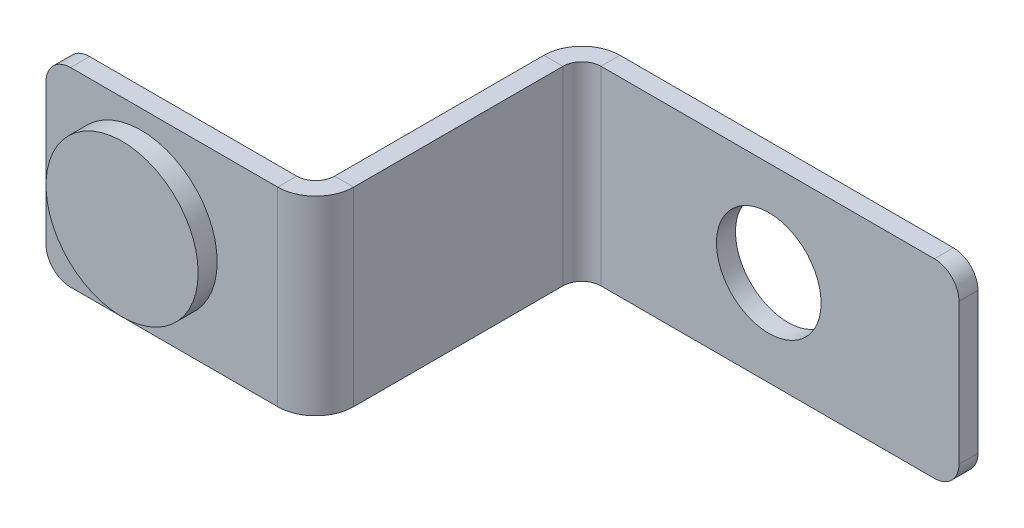
ISO-10303-21;
HEADER;
FILE_DESCRIPTION(('STEP AP214'),'2;1');
FILE_NAME('part.step','',(''),(''),'','','');
FILE_SCHEMA(('AUTOMOTIVE_DESIGN { 1 0 10303 214 1 1 1 1 }'));
ENDSEC;
DATA;
#1=APPLICATION_CONTEXT('core data for automotive mechanical design processes');
#2=APPLICATION_PROTOCOL_DEFINITION('international standard','automotive_design',2000,#1);
#3=PRODUCT_CONTEXT('',#1,'mechanical');
#4=PRODUCT('Part','Part','',(#3));
#5=PRODUCT_RELATED_PRODUCT_CATEGORY('part','',(#4));
#6=PRODUCT_DEFINITION_FORMATION('','',#4);
#7=PRODUCT_DEFINITION_CONTEXT('part definition',#1,'design');
#8=PRODUCT_DEFINITION('design','',#6,#7);
#9=PRODUCT_DEFINITION_SHAPE('','',#8);
#10=(LENGTH_UNIT() NAMED_UNIT(*) SI_UNIT(.MILLI.,.METRE.));
#11=(NAMED_UNIT(*) PLANE_ANGLE_UNIT() SI_UNIT($,.RADIAN.));
#12=(NAMED_UNIT(*) SI_UNIT($,.STERADIAN.) SOLID_ANGLE_UNIT());
#13=UNCERTAINTY_MEASURE_WITH_UNIT(LENGTH_MEASURE(1.E-05),#10,'distance_accuracy_value','');
#14=(GEOMETRIC_REPRESENTATION_CONTEXT(3) GLOBAL_UNCERTAINTY_ASSIGNED_CONTEXT((#13)) GLOBAL_UNIT_ASSIGNED_CONTEXT((#10,
#11,#12)) REPRESENTATION_CONTEXT('',''));
#15=CARTESIAN_POINT('',(0.,0.,0.));
#16=DIRECTION('',(0.,0.,1.));
#17=DIRECTION('',(1.,0.,0.));
#18=AXIS2_PLACEMENT_3D('',#15,#16,#17);
#19=CARTESIAN_POINT('',(5.,5.,15.));
#20=DIRECTION('',(0.,0.,-1.));
#21=DIRECTION('',(-1.,0.,0.));
#22=AXIS2_PLACEMENT_3D('',#19,#20,#21);
#23=CYLINDRICAL_SURFACE('',#22,4.);
#24=CARTESIAN_POINT('',(5.,5.,15.));
#25=DIRECTION('',(0.,0.,1.));
#26=DIRECTION('',(1.,0.,0.));
#27=AXIS2_PLACEMENT_3D('',#24,#25,#26);
#28=CIRCLE('',#27,4.);
#29=CARTESIAN_POINT('',(9.00000000000001,5.,15.));
#30=VERTEX_POINT('',#29);
#31=EDGE_CURVE('E12',#30,#30,#28,.T.);
#32=ORIENTED_EDGE('',*,*,#31,.F.);
#33=EDGE_LOOP('',(#32));
#34=FACE_BOUND('',#33,.T.);
#35=CARTESIAN_POINT('',(5.,5.,14.));
#36=DIRECTION('',(0.,0.,1.));
#37=DIRECTION('',(1.,0.,0.));
#38=AXIS2_PLACEMENT_3D('',#35,#36,#37);
#39=CIRCLE('',#38,4.);
#40=CARTESIAN_POINT('',(9.00000000000001,5.,14.));
#41=VERTEX_POINT('',#40);
#42=EDGE_CURVE('E56',#41,#41,#39,.T.);
#43=ORIENTED_EDGE('',*,*,#42,.T.);
#44=EDGE_LOOP('',(#43));
#45=FACE_BOUND('',#44,.T.);
#46=ADVANCED_FACE('F53',(#34,#45),#23,.T.);
#47=CARTESIAN_POINT('',(5.,5.,15.));
#48=DIRECTION('',(0.,0.,1.));
#49=DIRECTION('',(1.,0.,0.));
#50=AXIS2_PLACEMENT_3D('',#47,#48,#49);
#51=PLANE('',#50);
#52=ORIENTED_EDGE('',*,*,#31,.T.);
#53=EDGE_LOOP('',(#52));
#54=FACE_BOUND('',#53,.T.);
#55=ADVANCED_FACE('F68',(#54),#51,.T.);
#56=CARTESIAN_POINT('',(5.,5.,14.));
#57=DIRECTION('',(0.,0.,1.));
#58=DIRECTION('',(1.,0.,0.));
#59=AXIS2_PLACEMENT_3D('',#56,#57,#58);
#60=PLANE('',#59);
#61=ORIENTED_EDGE('',*,*,#42,.F.);
#62=EDGE_LOOP('',(#61));
#63=FACE_BOUND('',#62,.T.);
#64=ADVANCED_FACE('F66',(#63),#60,.F.);
#65=CLOSED_SHELL('',(#46,#55,#64));
#66=MANIFOLD_SOLID_BREP('B2',#65);
#67=CARTESIAN_POINT('',(13.1780972450961,1.29277566539924,-18.8853215796969));
#68=DIRECTION('',(1.,0.,0.));
#69=DIRECTION('',(0.,0.,-1.));
#70=AXIS2_PLACEMENT_3D('',#67,#68,#69);
#71=PLANE('',#70);
#72=DIRECTION('',(0.,0.,-1.));
#73=VECTOR('',#72,1.);
#74=CARTESIAN_POINT('',(13.1780972450962,0.,12.5291270895046));
#75=LINE('',#74,#73);
#76=CARTESIAN_POINT('',(13.1780972450962,0.,12.));
#77=VERTEX_POINT('',#76);
#78=CARTESIAN_POINT('',(13.1780972450962,0.,1.00000000000001));
#79=VERTEX_POINT('',#78);
#80=EDGE_CURVE('E98',#77,#79,#75,.T.);
#81=ORIENTED_EDGE('',*,*,#80,.F.);
#82=DIRECTION('',(0.,1.,0.));
#83=VECTOR('',#82,1.);
#84=CARTESIAN_POINT('',(13.1780972450962,1.29277566539924,12.));
#85=LINE('',#84,#83);
#86=CARTESIAN_POINT('',(13.1780972450962,10.,12.));
#87=VERTEX_POINT('',#86);
#88=EDGE_CURVE('E326',#77,#87,#85,.T.);
#89=ORIENTED_EDGE('',*,*,#88,.T.);
#90=DIRECTION('',(0.,0.,1.));
#91=VECTOR('',#90,1.);
#92=CARTESIAN_POINT('',(13.1780972450962,10.,12.5291270895046));
#93=LINE('',#92,#91);
#94=CARTESIAN_POINT('',(13.1780972450962,10.,1.00000000000001));
#95=VERTEX_POINT('',#94);
#96=EDGE_CURVE('E334',#95,#87,#93,.T.);
#97=ORIENTED_EDGE('',*,*,#96,.F.);
#98=DIRECTION('',(0.,1.,0.));
#99=VECTOR('',#98,1.);
#100=CARTESIAN_POINT('',(13.1780972450962,1.29277566539924,1.00000000000001));
#101=LINE('',#100,#99);
#102=EDGE_CURVE('E317',#79,#95,#101,.T.);
#103=ORIENTED_EDGE('',*,*,#102,.F.);
#104=EDGE_LOOP('',(#81,#89,#97,#103));
#105=FACE_BOUND('',#104,.T.);
#106=ADVANCED_FACE('F94',(#105),#71,.F.);
#107=CARTESIAN_POINT('',(13.1780972450962,0.,12.5291270895046));
#108=DIRECTION('',(0.,-1.,0.));
#109=DIRECTION('',(-1.,0.,0.));
#110=AXIS2_PLACEMENT_3D('',#107,#108,#109);
#111=PLANE('',#110);
#112=DIRECTION('',(1.,0.,0.));
#113=VECTOR('',#112,1.);
#114=CARTESIAN_POINT('',(13.1780972450962,0.,12.));
#115=LINE('',#114,#113);
#116=CARTESIAN_POINT('',(14.1780972450962,0.,12.));
#117=VERTEX_POINT('',#116);
#118=EDGE_CURVE('E329',#77,#117,#115,.T.);
#119=ORIENTED_EDGE('',*,*,#118,.F.);
#120=ORIENTED_EDGE('',*,*,#80,.T.);
#121=DIRECTION('',(1.,0.,0.));
#122=VECTOR('',#121,1.);
#123=CARTESIAN_POINT('',(13.1780972450962,0.,1.00000000000001));
#124=LINE('',#123,#122);
#125=CARTESIAN_POINT('',(14.1780972450962,0.,1.));
#126=VERTEX_POINT('',#125);
#127=EDGE_CURVE('E324',#79,#126,#124,.T.);
#128=ORIENTED_EDGE('',*,*,#127,.T.);
#129=DIRECTION('',(0.,0.,-1.));
#130=VECTOR('',#129,1.);
#131=CARTESIAN_POINT('',(14.1780972450962,0.,12.5291270895046));
#132=LINE('',#131,#130);
#133=EDGE_CURVE('E119',#117,#126,#132,.T.);
#134=ORIENTED_EDGE('',*,*,#133,.F.);
#135=EDGE_LOOP('',(#119,#120,#128,#134));
#136=FACE_BOUND('',#135,.T.);
#137=ADVANCED_FACE('F340',(#136),#111,.T.);
#138=CARTESIAN_POINT('',(13.1780972450962,10.,12.5291270895046));
#139=DIRECTION('',(0.,1.,0.));
#140=DIRECTION('',(1.,0.,0.));
#141=AXIS2_PLACEMENT_3D('',#138,#139,#140);
#142=PLANE('',#141);
#143=DIRECTION('',(-1.,0.,0.));
#144=VECTOR('',#143,1.);
#145=CARTESIAN_POINT('',(13.1780972450962,10.,12.));
#146=LINE('',#145,#144);
#147=CARTESIAN_POINT('',(14.1780972450962,10.,12.));
#148=VERTEX_POINT('',#147);
#149=EDGE_CURVE('E51',#148,#87,#146,.T.);
#150=ORIENTED_EDGE('',*,*,#149,.F.);
#151=DIRECTION('',(0.,0.,1.));
#152=VECTOR('',#151,1.);
#153=CARTESIAN_POINT('',(14.1780972450962,10.,12.5291270895046));
#154=LINE('',#153,#152);
#155=CARTESIAN_POINT('',(14.1780972450962,10.,1.));
#156=VERTEX_POINT('',#155);
#157=EDGE_CURVE('E111',#156,#148,#154,.T.);
#158=ORIENTED_EDGE('',*,*,#157,.F.);
#159=DIRECTION('',(-1.,0.,0.));
#160=VECTOR('',#159,1.);
#161=CARTESIAN_POINT('',(13.1780972450962,10.,1.00000000000001));
#162=LINE('',#161,#160);
#163=EDGE_CURVE('E320',#156,#95,#162,.T.);
#164=ORIENTED_EDGE('',*,*,#163,.T.);
#165=ORIENTED_EDGE('',*,*,#96,.T.);
#166=EDGE_LOOP('',(#150,#158,#164,#165));
#167=FACE_BOUND('',#166,.T.);
#168=ADVANCED_FACE('F96',(#167),#142,.T.);
#169=CARTESIAN_POINT('',(14.1780972450961,1.29277566539924,-18.8853215796969));
#170=DIRECTION('',(1.,0.,0.));
#171=DIRECTION('',(0.,0.,-1.));
#172=AXIS2_PLACEMENT_3D('',#169,#170,#171);
#173=PLANE('',#172);
#174=DIRECTION('',(0.,1.,0.));
#175=VECTOR('',#174,1.);
#176=CARTESIAN_POINT('',(14.1780972450962,1.29277566539924,12.));
#177=LINE('',#176,#175);
#178=EDGE_CURVE('E103',#117,#148,#177,.T.);
#179=ORIENTED_EDGE('',*,*,#178,.F.);
#180=ORIENTED_EDGE('',*,*,#133,.T.);
#181=DIRECTION('',(0.,1.,0.));
#182=VECTOR('',#181,1.);
#183=CARTESIAN_POINT('',(14.1780972450962,1.29277566539924,1.));
#184=LINE('',#183,#182);
#185=EDGE_CURVE('E322',#126,#156,#184,.T.);
#186=ORIENTED_EDGE('',*,*,#185,.T.);
#187=ORIENTED_EDGE('',*,*,#157,.T.);
#188=EDGE_LOOP('',(#179,#180,#186,#187));
#189=FACE_BOUND('',#188,.T.);
#190=ADVANCED_FACE('F336',(#189),#173,.T.);
#191=CARTESIAN_POINT('',(32.7072243346008,1.29277566539924,-1.));
#192=DIRECTION('',(0.,0.,1.));
#193=DIRECTION('',(1.,0.,0.));
#194=AXIS2_PLACEMENT_3D('',#191,#192,#193);
#195=CYLINDRICAL_SURFACE('',#194,1.29277566539924);
#196=CARTESIAN_POINT('',(32.7072243346008,1.29277566539924,0.));
#197=DIRECTION('',(0.,0.,1.));
#198=DIRECTION('',(1.,0.,0.));
#199=AXIS2_PLACEMENT_3D('',#196,#197,#198);
#200=CIRCLE('',#199,1.29277566539924);
#201=CARTESIAN_POINT('',(32.7072243346008,0.,0.));
#202=VERTEX_POINT('',#201);
#203=CARTESIAN_POINT('',(34.,1.29277566539925,0.));
#204=VERTEX_POINT('',#203);
#205=EDGE_CURVE('E278',#202,#204,#200,.T.);
#206=ORIENTED_EDGE('',*,*,#205,.F.);
#207=DIRECTION('',(0.,0.,1.));
#208=VECTOR('',#207,1.);
#209=CARTESIAN_POINT('',(32.7072243346008,0.,-1.));
#210=LINE('',#209,#208);
#211=CARTESIAN_POINT('',(32.7072243346008,0.,-1.));
#212=VERTEX_POINT('',#211);
#213=EDGE_CURVE('E265',#212,#202,#210,.T.);
#214=ORIENTED_EDGE('',*,*,#213,.F.);
#215=CARTESIAN_POINT('',(32.7072243346008,1.29277566539924,-1.));
#216=DIRECTION('',(0.,0.,1.));
#217=DIRECTION('',(1.,0.,0.));
#218=AXIS2_PLACEMENT_3D('',#215,#216,#217);
#219=CIRCLE('',#218,1.29277566539924);
#220=CARTESIAN_POINT('',(34.,1.29277566539925,-1.));
#221=VERTEX_POINT('',#220);
#222=EDGE_CURVE('E306',#212,#221,#219,.T.);
#223=ORIENTED_EDGE('',*,*,#222,.T.);
#224=DIRECTION('',(0.,0.,1.));
#225=VECTOR('',#224,1.);
#226=CARTESIAN_POINT('',(34.,1.29277566539925,-1.));
#227=LINE('',#226,#225);
#228=EDGE_CURVE('E304',#221,#204,#227,.T.);
#229=ORIENTED_EDGE('',*,*,#228,.T.);
#230=EDGE_LOOP('',(#206,#214,#223,#229));
#231=FACE_BOUND('',#230,.T.);
#232=ADVANCED_FACE('F380',(#231),#195,.T.);
#233=CARTESIAN_POINT('',(34.,1.29277566539925,-1.));
#234=DIRECTION('',(1.,0.,0.));
#235=DIRECTION('',(0.,0.,-1.));
#236=AXIS2_PLACEMENT_3D('',#233,#234,#235);
#237=PLANE('',#236);
#238=DIRECTION('',(0.,1.,0.));
#239=VECTOR('',#238,1.);
#240=CARTESIAN_POINT('',(34.,1.29277566539925,0.));
#241=LINE('',#240,#239);
#242=CARTESIAN_POINT('',(34.,8.70722433460075,0.));
#243=VERTEX_POINT('',#242);
#244=EDGE_CURVE('E275',#204,#243,#241,.T.);
#245=ORIENTED_EDGE('',*,*,#244,.F.);
#246=ORIENTED_EDGE('',*,*,#228,.F.);
#247=DIRECTION('',(0.,1.,0.));
#248=VECTOR('',#247,1.);
#249=CARTESIAN_POINT('',(34.,1.29277566539925,-1.));
#250=LINE('',#249,#248);
#251=CARTESIAN_POINT('',(34.,8.70722433460075,-1.));
#252=VERTEX_POINT('',#251);
#253=EDGE_CURVE('E301',#221,#252,#250,.T.);
#254=ORIENTED_EDGE('',*,*,#253,.T.);
#255=DIRECTION('',(0.,0.,1.));
#256=VECTOR('',#255,1.);
#257=CARTESIAN_POINT('',(34.,8.70722433460075,-1.));
#258=LINE('',#257,#256);
#259=EDGE_CURVE('E299',#252,#243,#258,.T.);
#260=ORIENTED_EDGE('',*,*,#259,.T.);
#261=EDGE_LOOP('',(#245,#246,#254,#260));
#262=FACE_BOUND('',#261,.T.);
#263=ADVANCED_FACE('F383',(#262),#237,.T.);
#264=CARTESIAN_POINT('',(32.7072243346008,8.70722433460076,-1.));
#265=DIRECTION('',(0.,0.,1.));
#266=DIRECTION('',(1.,0.,0.));
#267=AXIS2_PLACEMENT_3D('',#264,#265,#266);
#268=CYLINDRICAL_SURFACE('',#267,1.29277566539924);
#269=CARTESIAN_POINT('',(32.7072243346008,8.70722433460076,0.));
#270=DIRECTION('',(0.,0.,1.));
#271=DIRECTION('',(-1.,0.,0.));
#272=AXIS2_PLACEMENT_3D('',#269,#270,#271);
#273=CIRCLE('',#272,1.29277566539924);
#274=CARTESIAN_POINT('',(32.7072243346008,10.,0.));
#275=VERTEX_POINT('',#274);
#276=EDGE_CURVE('E272',#243,#275,#273,.T.);
#277=ORIENTED_EDGE('',*,*,#276,.F.);
#278=ORIENTED_EDGE('',*,*,#259,.F.);
#279=CARTESIAN_POINT('',(32.7072243346008,8.70722433460076,-1.));
#280=DIRECTION('',(0.,0.,1.));
#281=DIRECTION('',(-1.,0.,0.));
#282=AXIS2_PLACEMENT_3D('',#279,#280,#281);
#283=CIRCLE('',#282,1.29277566539924);
#284=CARTESIAN_POINT('',(32.7072243346008,10.,-1.));
#285=VERTEX_POINT('',#284);
#286=EDGE_CURVE('E296',#252,#285,#283,.T.);
#287=ORIENTED_EDGE('',*,*,#286,.T.);
#288=DIRECTION('',(0.,0.,1.));
#289=VECTOR('',#288,1.);
#290=CARTESIAN_POINT('',(32.7072243346008,10.,-1.));
#291=LINE('',#290,#289);
#292=EDGE_CURVE('E294',#285,#275,#291,.T.);
#293=ORIENTED_EDGE('',*,*,#292,.T.);
#294=EDGE_LOOP('',(#277,#278,#287,#293));
#295=FACE_BOUND('',#294,.T.);
#296=ADVANCED_FACE('F385',(#295),#268,.T.);
#297=CARTESIAN_POINT('',(24.,5.,-1.));
#298=DIRECTION('',(0.,0.,1.));
#299=DIRECTION('',(1.,0.,0.));
#300=AXIS2_PLACEMENT_3D('',#297,#298,#299);
#301=CYLINDRICAL_SURFACE('',#300,2.75);
#302=CARTESIAN_POINT('',(24.,5.,-1.));
#303=DIRECTION('',(0.,0.,1.));
#304=DIRECTION('',(1.,0.,0.));
#305=AXIS2_PLACEMENT_3D('',#302,#303,#304);
#306=CIRCLE('',#305,2.75);
#307=CARTESIAN_POINT('',(26.75,5.,-1.));
#308=VERTEX_POINT('',#307);
#309=EDGE_CURVE('E288',#308,#308,#306,.T.);
#310=ORIENTED_EDGE('',*,*,#309,.F.);
#311=EDGE_LOOP('',(#310));
#312=FACE_BOUND('',#311,.T.);
#313=CARTESIAN_POINT('',(24.,5.,0.));
#314=DIRECTION('',(0.,0.,1.));
#315=DIRECTION('',(1.,0.,0.));
#316=AXIS2_PLACEMENT_3D('',#313,#314,#315);
#317=CIRCLE('',#316,2.75);
#318=CARTESIAN_POINT('',(26.75,5.,0.));
#319=VERTEX_POINT('',#318);
#320=EDGE_CURVE('E291',#319,#319,#317,.T.);
#321=ORIENTED_EDGE('',*,*,#320,.T.);
#322=EDGE_LOOP('',(#321));
#323=FACE_BOUND('',#322,.T.);
#324=ADVANCED_FACE('F387',(#312,#323),#301,.F.);
#325=CARTESIAN_POINT('',(32.7072243346008,1.29277566539924,-1.));
#326=DIRECTION('',(0.,0.,1.));
#327=DIRECTION('',(1.,0.,0.));
#328=AXIS2_PLACEMENT_3D('',#325,#326,#327);
#329=PLANE('',#328);
#330=ORIENTED_EDGE('',*,*,#309,.T.);
#331=EDGE_LOOP('',(#330));
#332=FACE_BOUND('',#331,.T.);
#333=DIRECTION('',(1.,0.,0.));
#334=VECTOR('',#333,1.);
#335=CARTESIAN_POINT('',(1.29277566539925,0.,-1.));
#336=LINE('',#335,#334);
#337=CARTESIAN_POINT('',(15.1780972450962,0.,-1.));
#338=VERTEX_POINT('',#337);
#339=EDGE_CURVE('E268',#338,#212,#336,.T.);
#340=ORIENTED_EDGE('',*,*,#339,.F.);
#341=DIRECTION('',(0.,1.,0.));
#342=VECTOR('',#341,1.);
#343=CARTESIAN_POINT('',(15.1780972450962,1.29277566539924,-1.));
#344=LINE('',#343,#342);
#345=CARTESIAN_POINT('',(15.1780972450962,10.,-1.));
#346=VERTEX_POINT('',#345);
#347=EDGE_CURVE('E285',#338,#346,#344,.T.);
#348=ORIENTED_EDGE('',*,*,#347,.T.);
#349=DIRECTION('',(-1.,0.,0.));
#350=VECTOR('',#349,1.);
#351=CARTESIAN_POINT('',(1.29277566539925,10.,-1.));
#352=LINE('',#351,#350);
#353=EDGE_CURVE('E283',#285,#346,#352,.T.);
#354=ORIENTED_EDGE('',*,*,#353,.F.);
#355=ORIENTED_EDGE('',*,*,#286,.F.);
#356=ORIENTED_EDGE('',*,*,#253,.F.);
#357=ORIENTED_EDGE('',*,*,#222,.F.);
#358=EDGE_LOOP('',(#340,#348,#354,#355,#356,#357));
#359=FACE_BOUND('',#358,.T.);
#360=ADVANCED_FACE('F375',(#332,#359),#329,.F.);
#361=CARTESIAN_POINT('',(1.29277566539925,10.,-1.));
#362=DIRECTION('',(0.,1.,0.));
#363=DIRECTION('',(0.,0.,1.));
#364=AXIS2_PLACEMENT_3D('',#361,#362,#363);
#365=PLANE('',#364);
#366=DIRECTION('',(0.,0.,-1.));
#367=VECTOR('',#366,1.);
#368=CARTESIAN_POINT('',(15.1780972450962,10.,-1.));
#369=LINE('',#368,#367);
#370=CARTESIAN_POINT('',(15.1780972450962,10.,0.));
#371=VERTEX_POINT('',#370);
#372=EDGE_CURVE('E309',#371,#346,#369,.T.);
#373=ORIENTED_EDGE('',*,*,#372,.F.);
#374=DIRECTION('',(-1.,0.,0.));
#375=VECTOR('',#374,1.);
#376=CARTESIAN_POINT('',(1.29277566539925,10.,0.));
#377=LINE('',#376,#375);
#378=EDGE_CURVE('E270',#275,#371,#377,.T.);
#379=ORIENTED_EDGE('',*,*,#378,.F.);
#380=ORIENTED_EDGE('',*,*,#292,.F.);
#381=ORIENTED_EDGE('',*,*,#353,.T.);
#382=EDGE_LOOP('',(#373,#379,#380,#381));
#383=FACE_BOUND('',#382,.T.);
#384=ADVANCED_FACE('F363',(#383),#365,.T.);
#385=CARTESIAN_POINT('',(32.7072243346008,1.29277566539924,0.));
#386=DIRECTION('',(0.,0.,1.));
#387=DIRECTION('',(1.,0.,0.));
#388=AXIS2_PLACEMENT_3D('',#385,#386,#387);
#389=PLANE('',#388);
#390=DIRECTION('',(0.,1.,0.));
#391=VECTOR('',#390,1.);
#392=CARTESIAN_POINT('',(15.1780972450962,1.29277566539924,0.));
#393=LINE('',#392,#391);
#394=CARTESIAN_POINT('',(15.1780972450962,0.,0.));
#395=VERTEX_POINT('',#394);
#396=EDGE_CURVE('E312',#395,#371,#393,.T.);
#397=ORIENTED_EDGE('',*,*,#396,.F.);
#398=DIRECTION('',(1.,0.,0.));
#399=VECTOR('',#398,1.);
#400=CARTESIAN_POINT('',(1.29277566539925,0.,0.));
#401=LINE('',#400,#399);
#402=EDGE_CURVE('E281',#395,#202,#401,.T.);
#403=ORIENTED_EDGE('',*,*,#402,.T.);
#404=ORIENTED_EDGE('',*,*,#205,.T.);
#405=ORIENTED_EDGE('',*,*,#244,.T.);
#406=ORIENTED_EDGE('',*,*,#276,.T.);
#407=ORIENTED_EDGE('',*,*,#378,.T.);
#408=EDGE_LOOP('',(#397,#403,#404,#405,#406,#407));
#409=FACE_BOUND('',#408,.T.);
#410=ORIENTED_EDGE('',*,*,#320,.F.);
#411=EDGE_LOOP('',(#410));
#412=FACE_BOUND('',#411,.T.);
#413=ADVANCED_FACE('F357',(#409,#412),#389,.T.);
#414=CARTESIAN_POINT('',(1.29277566539925,0.,-1.));
#415=DIRECTION('',(0.,-1.,0.));
#416=DIRECTION('',(0.,0.,-1.));
#417=AXIS2_PLACEMENT_3D('',#414,#415,#416);
#418=PLANE('',#417);
#419=DIRECTION('',(0.,0.,1.));
#420=VECTOR('',#419,1.);
#421=CARTESIAN_POINT('',(15.1780972450962,0.,-1.));
#422=LINE('',#421,#420);
#423=EDGE_CURVE('E260',#338,#395,#422,.T.);
#424=ORIENTED_EDGE('',*,*,#423,.F.);
#425=ORIENTED_EDGE('',*,*,#339,.T.);
#426=ORIENTED_EDGE('',*,*,#213,.T.);
#427=ORIENTED_EDGE('',*,*,#402,.F.);
#428=EDGE_LOOP('',(#424,#425,#426,#427));
#429=FACE_BOUND('',#428,.T.);
#430=ADVANCED_FACE('F352',(#429),#418,.T.);
#431=CARTESIAN_POINT('',(15.1780972450962,0.,1.));
#432=DIRECTION('',(0.,-1.,0.));
#433=DIRECTION('',(1.,0.,0.));
#434=AXIS2_PLACEMENT_3D('',#431,#432,#433);
#435=PLANE('',#434);
#436=ORIENTED_EDGE('',*,*,#423,.T.);
#437=CARTESIAN_POINT('',(15.1780972450962,0.,1.));
#438=DIRECTION('',(0.,1.,0.));
#439=DIRECTION('',(-1.,0.,0.));
#440=AXIS2_PLACEMENT_3D('',#437,#438,#439);
#441=CIRCLE('',#440,1.);
#442=EDGE_CURVE('E248',#395,#126,#441,.T.);
#443=ORIENTED_EDGE('',*,*,#442,.T.);
#444=ORIENTED_EDGE('',*,*,#127,.F.);
#445=CARTESIAN_POINT('',(15.1780972450962,0.,1.));
#446=DIRECTION('',(0.,1.,0.));
#447=DIRECTION('',(1.,0.,0.));
#448=AXIS2_PLACEMENT_3D('',#445,#446,#447);
#449=CIRCLE('',#448,2.);
#450=EDGE_CURVE('E253',#338,#79,#449,.T.);
#451=ORIENTED_EDGE('',*,*,#450,.F.);
#452=EDGE_LOOP('',(#436,#443,#444,#451));
#453=FACE_BOUND('',#452,.T.);
#454=ADVANCED_FACE('F348',(#453),#435,.T.);
#455=CARTESIAN_POINT('',(15.1780972450962,10.,1.));
#456=DIRECTION('',(0.,1.,0.));
#457=DIRECTION('',(-1.,0.,0.));
#458=AXIS2_PLACEMENT_3D('',#455,#456,#457);
#459=PLANE('',#458);
#460=ORIENTED_EDGE('',*,*,#163,.F.);
#461=CARTESIAN_POINT('',(15.1780972450962,10.,1.));
#462=DIRECTION('',(0.,1.,0.));
#463=DIRECTION('',(-1.,0.,0.));
#464=AXIS2_PLACEMENT_3D('',#461,#462,#463);
#465=CIRCLE('',#464,1.);
#466=EDGE_CURVE('E257',#156,#371,#465,.F.);
#467=ORIENTED_EDGE('',*,*,#466,.T.);
#468=ORIENTED_EDGE('',*,*,#372,.T.);
#469=CARTESIAN_POINT('',(15.1780972450962,10.,1.));
#470=DIRECTION('',(0.,-1.,0.));
#471=DIRECTION('',(-1.,0.,0.));
#472=AXIS2_PLACEMENT_3D('',#469,#470,#471);
#473=CIRCLE('',#472,2.);
#474=EDGE_CURVE('E256',#95,#346,#473,.T.);
#475=ORIENTED_EDGE('',*,*,#474,.F.);
#476=EDGE_LOOP('',(#460,#467,#468,#475));
#477=FACE_BOUND('',#476,.T.);
#478=ADVANCED_FACE('F367',(#477),#459,.T.);
#479=CARTESIAN_POINT('',(15.1780972450962,-5.32238598753277,1.));
#480=DIRECTION('',(0.,1.,0.));
#481=DIRECTION('',(-1.,0.,0.));
#482=AXIS2_PLACEMENT_3D('',#479,#480,#481);
#483=CYLINDRICAL_SURFACE('',#482,2.);
#484=ORIENTED_EDGE('',*,*,#474,.T.);
#485=ORIENTED_EDGE('',*,*,#347,.F.);
#486=ORIENTED_EDGE('',*,*,#450,.T.);
#487=ORIENTED_EDGE('',*,*,#102,.T.);
#488=EDGE_LOOP('',(#484,#485,#486,#487));
#489=FACE_BOUND('',#488,.T.);
#490=ADVANCED_FACE('F373',(#489),#483,.T.);
#491=CARTESIAN_POINT('',(15.1780972450962,-5.32238598753277,1.));
#492=DIRECTION('',(0.,1.,0.));
#493=DIRECTION('',(-1.,0.,0.));
#494=AXIS2_PLACEMENT_3D('',#491,#492,#493);
#495=CYLINDRICAL_SURFACE('',#494,1.);
#496=ORIENTED_EDGE('',*,*,#466,.F.);
#497=ORIENTED_EDGE('',*,*,#185,.F.);
#498=ORIENTED_EDGE('',*,*,#442,.F.);
#499=ORIENTED_EDGE('',*,*,#396,.T.);
#500=EDGE_LOOP('',(#496,#497,#498,#499));
#501=FACE_BOUND('',#500,.T.);
#502=ADVANCED_FACE('F347',(#501),#495,.F.);
#503=CARTESIAN_POINT('',(12.1780972450962,0.,12.));
#504=DIRECTION('',(0.,1.,0.));
#505=DIRECTION('',(-1.,0.,0.));
#506=AXIS2_PLACEMENT_3D('',#503,#504,#505);
#507=PLANE('',#506);
#508=ORIENTED_EDGE('',*,*,#118,.T.);
#509=CARTESIAN_POINT('',(12.1780972450962,0.,12.));
#510=DIRECTION('',(0.,1.,0.));
#511=DIRECTION('',(-1.,0.,0.));
#512=AXIS2_PLACEMENT_3D('',#509,#510,#511);
#513=CIRCLE('',#512,2.);
#514=CARTESIAN_POINT('',(12.1780972450962,0.,14.));
#515=VERTEX_POINT('',#514);
#516=EDGE_CURVE('E227',#117,#515,#513,.F.);
#517=ORIENTED_EDGE('',*,*,#516,.T.);
#518=DIRECTION('',(0.,0.,1.));
#519=VECTOR('',#518,1.);
#520=CARTESIAN_POINT('',(12.1780972450962,0.,13.));
#521=LINE('',#520,#519);
#522=CARTESIAN_POINT('',(12.1780972450962,0.,13.));
#523=VERTEX_POINT('',#522);
#524=EDGE_CURVE('E684',#523,#515,#521,.T.);
#525=ORIENTED_EDGE('',*,*,#524,.F.);
#526=CARTESIAN_POINT('',(12.1780972450962,0.,12.));
#527=DIRECTION('',(0.,-1.,0.));
#528=DIRECTION('',(-1.,0.,0.));
#529=AXIS2_PLACEMENT_3D('',#526,#527,#528);
#530=CIRCLE('',#529,1.);
#531=EDGE_CURVE('E241',#77,#523,#530,.T.);
#532=ORIENTED_EDGE('',*,*,#531,.F.);
#533=EDGE_LOOP('',(#508,#517,#525,#532));
#534=FACE_BOUND('',#533,.T.);
#535=ADVANCED_FACE('F572',(#534),#507,.F.);
#536=CARTESIAN_POINT('',(12.1780972450962,10.,12.));
#537=DIRECTION('',(0.,-1.,0.));
#538=DIRECTION('',(0.,0.,-1.));
#539=AXIS2_PLACEMENT_3D('',#536,#537,#538);
#540=PLANE('',#539);
#541=DIRECTION('',(0.,0.,-1.));
#542=VECTOR('',#541,1.);
#543=CARTESIAN_POINT('',(12.1780972450962,10.,13.));
#544=LINE('',#543,#542);
#545=CARTESIAN_POINT('',(12.1780972450962,10.,14.));
#546=VERTEX_POINT('',#545);
#547=CARTESIAN_POINT('',(12.1780972450962,10.,13.));
#548=VERTEX_POINT('',#547);
#549=EDGE_CURVE('E216',#546,#548,#544,.T.);
#550=ORIENTED_EDGE('',*,*,#549,.F.);
#551=CARTESIAN_POINT('',(12.1780972450962,10.,12.));
#552=DIRECTION('',(0.,1.,0.));
#553=DIRECTION('',(-1.,0.,0.));
#554=AXIS2_PLACEMENT_3D('',#551,#552,#553);
#555=CIRCLE('',#554,2.);
#556=EDGE_CURVE('E245',#546,#148,#555,.T.);
#557=ORIENTED_EDGE('',*,*,#556,.T.);
#558=ORIENTED_EDGE('',*,*,#149,.T.);
#559=CARTESIAN_POINT('',(12.1780972450962,10.,12.));
#560=DIRECTION('',(0.,1.,0.));
#561=DIRECTION('',(0.,0.,-1.));
#562=AXIS2_PLACEMENT_3D('',#559,#560,#561);
#563=CIRCLE('',#562,1.);
#564=EDGE_CURVE('E244',#548,#87,#563,.T.);
#565=ORIENTED_EDGE('',*,*,#564,.F.);
#566=EDGE_LOOP('',(#550,#557,#558,#565));
#567=FACE_BOUND('',#566,.T.);
#568=ADVANCED_FACE('F579',(#567),#540,.F.);
#569=CARTESIAN_POINT('',(12.1780972450962,-5.32238598753277,12.));
#570=DIRECTION('',(0.,1.,0.));
#571=DIRECTION('',(-1.,0.,0.));
#572=AXIS2_PLACEMENT_3D('',#569,#570,#571);
#573=CYLINDRICAL_SURFACE('',#572,1.);
#574=ORIENTED_EDGE('',*,*,#564,.T.);
#575=ORIENTED_EDGE('',*,*,#88,.F.);
#576=ORIENTED_EDGE('',*,*,#531,.T.);
#577=DIRECTION('',(0.,1.,0.));
#578=VECTOR('',#577,1.);
#579=CARTESIAN_POINT('',(12.1780972450962,1.29277566539924,13.));
#580=LINE('',#579,#578);
#581=EDGE_CURVE('E235',#523,#548,#580,.T.);
#582=ORIENTED_EDGE('',*,*,#581,.T.);
#583=EDGE_LOOP('',(#574,#575,#576,#582));
#584=FACE_BOUND('',#583,.T.);
#585=ADVANCED_FACE('F587',(#584),#573,.F.);
#586=CARTESIAN_POINT('',(12.1780972450962,-5.32238598753277,12.));
#587=DIRECTION('',(0.,1.,0.));
#588=DIRECTION('',(-1.,0.,0.));
#589=AXIS2_PLACEMENT_3D('',#586,#587,#588);
#590=CYLINDRICAL_SURFACE('',#589,2.);
#591=ORIENTED_EDGE('',*,*,#556,.F.);
#592=DIRECTION('',(0.,1.,0.));
#593=VECTOR('',#592,1.);
#594=CARTESIAN_POINT('',(12.1780972450962,1.29277566539924,14.));
#595=LINE('',#594,#593);
#596=EDGE_CURVE('E678',#515,#546,#595,.T.);
#597=ORIENTED_EDGE('',*,*,#596,.F.);
#598=ORIENTED_EDGE('',*,*,#516,.F.);
#599=ORIENTED_EDGE('',*,*,#178,.T.);
#600=EDGE_LOOP('',(#591,#597,#598,#599));
#601=FACE_BOUND('',#600,.T.);
#602=ADVANCED_FACE('F475',(#601),#590,.T.);
#603=CARTESIAN_POINT('',(1.29277566539928,8.70722433460076,13.));
#604=DIRECTION('',(0.,0.,1.));
#605=DIRECTION('',(1.,0.,0.));
#606=AXIS2_PLACEMENT_3D('',#603,#604,#605);
#607=CYLINDRICAL_SURFACE('',#606,1.29277566539924);
#608=CARTESIAN_POINT('',(1.29277566539928,8.70722433460076,14.));
#609=DIRECTION('',(0.,0.,1.));
#610=DIRECTION('',(-1.,0.,0.));
#611=AXIS2_PLACEMENT_3D('',#608,#609,#610);
#612=CIRCLE('',#611,1.29277566539924);
#613=CARTESIAN_POINT('',(1.29277566539929,10.,14.));
#614=VERTEX_POINT('',#613);
#615=CARTESIAN_POINT('',(0.,8.70722433460075,14.));
#616=VERTEX_POINT('',#615);
#617=EDGE_CURVE('E226',#614,#616,#612,.T.);
#618=ORIENTED_EDGE('',*,*,#617,.F.);
#619=DIRECTION('',(0.,0.,1.));
#620=VECTOR('',#619,1.);
#621=CARTESIAN_POINT('',(1.29277566539929,10.,13.));
#622=LINE('',#621,#620);
#623=CARTESIAN_POINT('',(1.29277566539929,10.,13.));
#624=VERTEX_POINT('',#623);
#625=EDGE_CURVE('E213',#624,#614,#622,.T.);
#626=ORIENTED_EDGE('',*,*,#625,.F.);
#627=CARTESIAN_POINT('',(1.29277566539928,8.70722433460076,13.));
#628=DIRECTION('',(0.,0.,1.));
#629=DIRECTION('',(-1.,0.,0.));
#630=AXIS2_PLACEMENT_3D('',#627,#628,#629);
#631=CIRCLE('',#630,1.29277566539924);
#632=CARTESIAN_POINT('',(0.,8.70722433460075,13.));
#633=VERTEX_POINT('',#632);
#634=EDGE_CURVE('E224',#624,#633,#631,.T.);
#635=ORIENTED_EDGE('',*,*,#634,.T.);
#636=DIRECTION('',(0.,0.,1.));
#637=VECTOR('',#636,1.);
#638=CARTESIAN_POINT('',(0.,8.70722433460075,13.));
#639=LINE('',#638,#637);
#640=EDGE_CURVE('E234',#633,#616,#639,.T.);
#641=ORIENTED_EDGE('',*,*,#640,.T.);
#642=EDGE_LOOP('',(#618,#626,#635,#641));
#643=FACE_BOUND('',#642,.T.);
#644=ADVANCED_FACE('F223',(#643),#607,.T.);
#645=CARTESIAN_POINT('',(0.,1.29277566539925,13.));
#646=DIRECTION('',(-1.,0.,0.));
#647=DIRECTION('',(0.,0.,1.));
#648=AXIS2_PLACEMENT_3D('',#645,#646,#647);
#649=PLANE('',#648);
#650=DIRECTION('',(0.,-1.,0.));
#651=VECTOR('',#650,1.);
#652=CARTESIAN_POINT('',(0.,1.29277566539925,14.));
#653=LINE('',#652,#651);
#654=CARTESIAN_POINT('',(0.,1.29277566539924,14.));
#655=VERTEX_POINT('',#654);
#656=EDGE_CURVE('E697',#616,#655,#653,.T.);
#657=ORIENTED_EDGE('',*,*,#656,.F.);
#658=ORIENTED_EDGE('',*,*,#640,.F.);
#659=DIRECTION('',(0.,-1.,0.));
#660=VECTOR('',#659,1.);
#661=CARTESIAN_POINT('',(0.,1.29277566539925,13.));
#662=LINE('',#661,#660);
#663=CARTESIAN_POINT('',(0.,1.29277566539924,13.));
#664=VERTEX_POINT('',#663);
#665=EDGE_CURVE('E233',#633,#664,#662,.T.);
#666=ORIENTED_EDGE('',*,*,#665,.T.);
#667=DIRECTION('',(0.,0.,1.));
#668=VECTOR('',#667,1.);
#669=CARTESIAN_POINT('',(0.,1.29277566539924,13.));
#670=LINE('',#669,#668);
#671=EDGE_CURVE('E709',#664,#655,#670,.T.);
#672=ORIENTED_EDGE('',*,*,#671,.T.);
#673=EDGE_LOOP('',(#657,#658,#666,#672));
#674=FACE_BOUND('',#673,.T.);
#675=ADVANCED_FACE('F456',(#674),#649,.T.);
#676=CARTESIAN_POINT('',(1.29277566539928,1.29277566539924,13.));
#677=DIRECTION('',(0.,0.,1.));
#678=DIRECTION('',(1.,0.,0.));
#679=AXIS2_PLACEMENT_3D('',#676,#677,#678);
#680=CYLINDRICAL_SURFACE('',#679,1.29277566539924);
#681=CARTESIAN_POINT('',(1.29277566539929,1.29277566539924,14.));
#682=DIRECTION('',(0.,0.,1.));
#683=DIRECTION('',(-1.,0.,0.));
#684=AXIS2_PLACEMENT_3D('',#681,#682,#683);
#685=CIRCLE('',#684,1.29277566539924);
#686=CARTESIAN_POINT('',(1.29277566539929,0.,14.));
#687=VERTEX_POINT('',#686);
#688=EDGE_CURVE('E681',#655,#687,#685,.T.);
#689=ORIENTED_EDGE('',*,*,#688,.F.);
#690=ORIENTED_EDGE('',*,*,#671,.F.);
#691=CARTESIAN_POINT('',(1.29277566539928,1.29277566539924,13.));
#692=DIRECTION('',(0.,0.,1.));
#693=DIRECTION('',(-1.,0.,0.));
#694=AXIS2_PLACEMENT_3D('',#691,#692,#693);
#695=CIRCLE('',#694,1.29277566539924);
#696=CARTESIAN_POINT('',(1.29277566539929,0.,13.));
#697=VERTEX_POINT('',#696);
#698=EDGE_CURVE('E706',#664,#697,#695,.T.);
#699=ORIENTED_EDGE('',*,*,#698,.T.);
#700=DIRECTION('',(0.,0.,1.));
#701=VECTOR('',#700,1.);
#702=CARTESIAN_POINT('',(1.29277566539929,0.,13.));
#703=LINE('',#702,#701);
#704=EDGE_CURVE('E704',#697,#687,#703,.T.);
#705=ORIENTED_EDGE('',*,*,#704,.T.);
#706=EDGE_LOOP('',(#689,#690,#699,#705));
#707=FACE_BOUND('',#706,.T.);
#708=ADVANCED_FACE('F450',(#707),#680,.T.);
#709=CARTESIAN_POINT('',(45.4196133149855,1.29277566539924,13.));
#710=DIRECTION('',(0.,0.,1.));
#711=DIRECTION('',(1.,0.,0.));
#712=AXIS2_PLACEMENT_3D('',#709,#710,#711);
#713=PLANE('',#712);
#714=ORIENTED_EDGE('',*,*,#581,.F.);
#715=DIRECTION('',(1.,0.,0.));
#716=VECTOR('',#715,1.);
#717=CARTESIAN_POINT('',(14.005164645784,0.,13.));
#718=LINE('',#717,#716);
#719=EDGE_CURVE('E688',#697,#523,#718,.T.);
#720=ORIENTED_EDGE('',*,*,#719,.F.);
#721=ORIENTED_EDGE('',*,*,#698,.F.);
#722=ORIENTED_EDGE('',*,*,#665,.F.);
#723=ORIENTED_EDGE('',*,*,#634,.F.);
#724=DIRECTION('',(-1.,0.,0.));
#725=VECTOR('',#724,1.);
#726=CARTESIAN_POINT('',(14.005164645784,10.,13.));
#727=LINE('',#726,#725);
#728=EDGE_CURVE('E210',#548,#624,#727,.T.);
#729=ORIENTED_EDGE('',*,*,#728,.F.);
#730=EDGE_LOOP('',(#714,#720,#721,#722,#723,#729));
#731=FACE_BOUND('',#730,.T.);
#732=ADVANCED_FACE('F230',(#731),#713,.F.);
#733=CARTESIAN_POINT('',(14.005164645784,0.,13.));
#734=DIRECTION('',(0.,-1.,0.));
#735=DIRECTION('',(0.,0.,-1.));
#736=AXIS2_PLACEMENT_3D('',#733,#734,#735);
#737=PLANE('',#736);
#738=ORIENTED_EDGE('',*,*,#719,.T.);
#739=ORIENTED_EDGE('',*,*,#524,.T.);
#740=DIRECTION('',(1.,0.,0.));
#741=VECTOR('',#740,1.);
#742=CARTESIAN_POINT('',(14.005164645784,0.,14.));
#743=LINE('',#742,#741);
#744=EDGE_CURVE('E675',#687,#515,#743,.T.);
#745=ORIENTED_EDGE('',*,*,#744,.F.);
#746=ORIENTED_EDGE('',*,*,#704,.F.);
#747=EDGE_LOOP('',(#738,#739,#745,#746));
#748=FACE_BOUND('',#747,.T.);
#749=ADVANCED_FACE('F439',(#748),#737,.T.);
#750=CARTESIAN_POINT('',(45.4196133149855,1.29277566539924,14.));
#751=DIRECTION('',(0.,0.,1.));
#752=DIRECTION('',(1.,0.,0.));
#753=AXIS2_PLACEMENT_3D('',#750,#751,#752);
#754=PLANE('',#753);
#755=ORIENTED_EDGE('',*,*,#744,.T.);
#756=ORIENTED_EDGE('',*,*,#596,.T.);
#757=DIRECTION('',(-1.,0.,0.));
#758=VECTOR('',#757,1.);
#759=CARTESIAN_POINT('',(14.005164645784,10.,14.));
#760=LINE('',#759,#758);
#761=EDGE_CURVE('E693',#546,#614,#760,.T.);
#762=ORIENTED_EDGE('',*,*,#761,.T.);
#763=ORIENTED_EDGE('',*,*,#617,.T.);
#764=ORIENTED_EDGE('',*,*,#656,.T.);
#765=ORIENTED_EDGE('',*,*,#688,.T.);
#766=EDGE_LOOP('',(#755,#756,#762,#763,#764,#765));
#767=FACE_BOUND('',#766,.T.);
#768=ADVANCED_FACE('F434',(#767),#754,.T.);
#769=CARTESIAN_POINT('',(14.005164645784,10.,13.));
#770=DIRECTION('',(0.,1.,0.));
#771=DIRECTION('',(0.,0.,1.));
#772=AXIS2_PLACEMENT_3D('',#769,#770,#771);
#773=PLANE('',#772);
#774=ORIENTED_EDGE('',*,*,#761,.F.);
#775=ORIENTED_EDGE('',*,*,#549,.T.);
#776=ORIENTED_EDGE('',*,*,#728,.T.);
#777=ORIENTED_EDGE('',*,*,#625,.T.);
#778=EDGE_LOOP('',(#774,#775,#776,#777));
#779=FACE_BOUND('',#778,.T.);
#780=ADVANCED_FACE('F212',(#779),#773,.T.);
#781=CLOSED_SHELL('',(#106,#137,#168,#190,#232,#263,#296,#324,#360,#384,#413,#430,#454,#478,
#490,#502,#535,#568,#585,#602,#644,#675,#708,#732,#749,#768,#780));
#782=MANIFOLD_SOLID_BREP('B7',#781);
#783=ADVANCED_BREP_SHAPE_REPRESENTATION('',(#18,#66,#782),#14);
#784=SHAPE_DEFINITION_REPRESENTATION(#9,#783);
ENDSEC;
END-ISO-10303-21;
